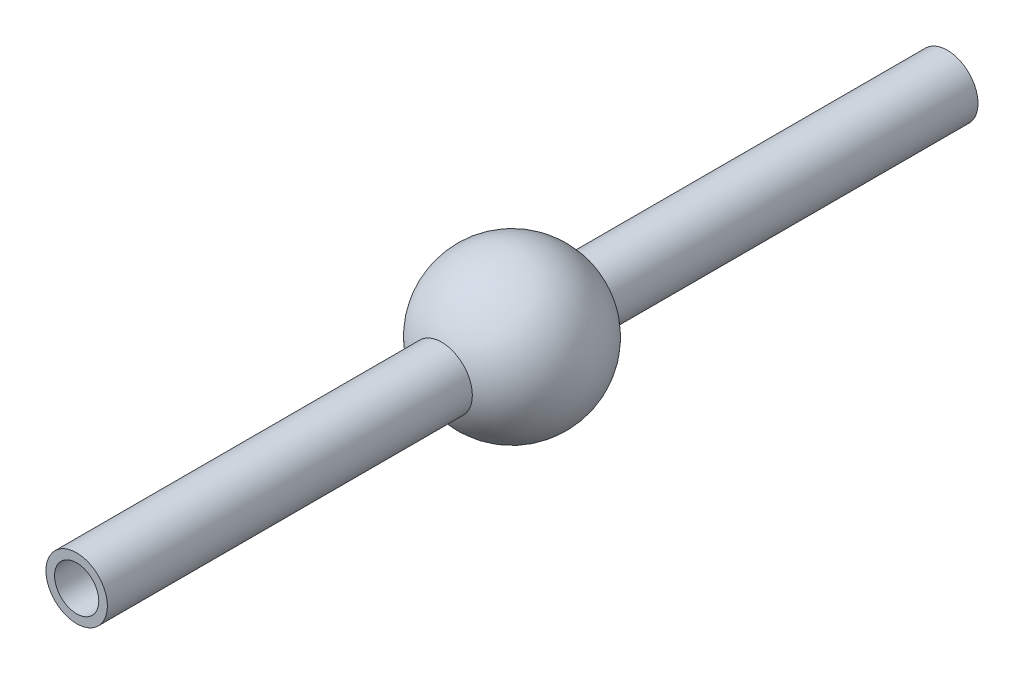
ISO-10303-21;
HEADER;
FILE_DESCRIPTION(('STEP AP214'),'2;1');
FILE_NAME('part.step','',(''),(''),'','','');
FILE_SCHEMA(('AUTOMOTIVE_DESIGN { 1 0 10303 214 1 1 1 1 }'));
ENDSEC;
DATA;
#1=APPLICATION_CONTEXT('core data for automotive mechanical design processes');
#2=APPLICATION_PROTOCOL_DEFINITION('international standard','automotive_design',2000,#1);
#3=PRODUCT_CONTEXT('',#1,'mechanical');
#4=PRODUCT('Part','Part','',(#3));
#5=PRODUCT_RELATED_PRODUCT_CATEGORY('part','',(#4));
#6=PRODUCT_DEFINITION_FORMATION('','',#4);
#7=PRODUCT_DEFINITION_CONTEXT('part definition',#1,'design');
#8=PRODUCT_DEFINITION('design','',#6,#7);
#9=PRODUCT_DEFINITION_SHAPE('','',#8);
#10=(LENGTH_UNIT() NAMED_UNIT(*) SI_UNIT(.MILLI.,.METRE.));
#11=(NAMED_UNIT(*) PLANE_ANGLE_UNIT() SI_UNIT($,.RADIAN.));
#12=(NAMED_UNIT(*) SI_UNIT($,.STERADIAN.) SOLID_ANGLE_UNIT());
#13=UNCERTAINTY_MEASURE_WITH_UNIT(LENGTH_MEASURE(1.E-05),#10,'distance_accuracy_value','');
#14=(GEOMETRIC_REPRESENTATION_CONTEXT(3) GLOBAL_UNCERTAINTY_ASSIGNED_CONTEXT((#13)) GLOBAL_UNIT_ASSIGNED_CONTEXT((#10,
#11,#12)) REPRESENTATION_CONTEXT('',''));
#15=CARTESIAN_POINT('',(0.,0.,0.));
#16=DIRECTION('',(0.,0.,1.));
#17=DIRECTION('',(1.,0.,0.));
#18=AXIS2_PLACEMENT_3D('',#15,#16,#17);
#19=CARTESIAN_POINT('',(0.,0.,0.));
#20=DIRECTION('',(0.,0.,-1.));
#21=DIRECTION('',(1.,0.,0.));
#22=AXIS2_PLACEMENT_3D('',#19,#20,#21);
#23=SPHERICAL_SURFACE('',#22,7.935);
#24=CARTESIAN_POINT('',(0.,0.,7.27211111026227));
#25=DIRECTION('',(0.,0.,-1.));
#26=DIRECTION('',(-1.,0.,0.));
#27=AXIS2_PLACEMENT_3D('',#24,#25,#26);
#28=CIRCLE('',#27,3.175);
#29=CARTESIAN_POINT('',(3.175,0.,7.27211111026227));
#30=VERTEX_POINT('',#29);
#31=EDGE_CURVE('E10',#30,#30,#28,.F.);
#32=CARTESIAN_POINT('',(0.,0.,-7.27211111026227));
#33=DIRECTION('',(0.,0.,1.));
#34=DIRECTION('',(1.,0.,0.));
#35=AXIS2_PLACEMENT_3D('',#32,#33,#34);
#36=CIRCLE('',#35,3.175);
#37=CARTESIAN_POINT('',(3.175,0.,-7.27211111026227));
#38=VERTEX_POINT('',#37);
#39=EDGE_CURVE('E36',#38,#38,#36,.F.);
#40=CARTESIAN_POINT('',(3.175,0.,7.27211111026227));
#41=CARTESIAN_POINT('',(3.35061875408829,0.,7.19545028966584));
#42=CARTESIAN_POINT('',(3.5234484279392,0.,7.1124053788516));
#43=CARTESIAN_POINT('',(3.86264964001572,0.,6.93403386141682));
#44=CARTESIAN_POINT('',(4.02902117824133,0.,6.83870725479628));
#45=CARTESIAN_POINT('',(4.3544261439167,0.,6.63625883037816));
#46=CARTESIAN_POINT('',(4.51345957136648,0.,6.52913701258059));
#47=CARTESIAN_POINT('',(4.82335591567042,0.,6.30366379476571));
#48=CARTESIAN_POINT('',(4.97421883252459,0.,6.18531239474841));
#49=CARTESIAN_POINT('',(5.26698218728778,0.,5.93799992787177));
#50=CARTESIAN_POINT('',(5.40888262519679,0.,5.80903886101244));
#51=CARTESIAN_POINT('',(5.68297672430487,0.,5.54118387560699));
#52=CARTESIAN_POINT('',(5.81517038550393,0.,5.40228995706086));
#53=CARTESIAN_POINT('',(6.06915738229662,0.,5.11529786085084));
#54=CARTESIAN_POINT('',(6.19095071789024,0.,4.96719968318695));
#55=CARTESIAN_POINT('',(6.42349812337258,0.,4.66257603752238));
#56=CARTESIAN_POINT('',(6.5342521932613,0.,4.5060505695217));
#57=CARTESIAN_POINT('',(6.74414002869088,0.,4.18539349921624));
#58=CARTESIAN_POINT('',(6.84327379423173,0.,4.02126189691145));
#59=CARTESIAN_POINT('',(7.02940094791241,0.,3.68625362358385));
#60=CARTESIAN_POINT('',(7.11639433605223,0.,3.51537695256104));
#61=CARTESIAN_POINT('',(7.27778435160519,0.,3.16777499152858));
#62=CARTESIAN_POINT('',(7.35218097901833,0.,2.99104970151894));
#63=CARTESIAN_POINT('',(7.48798717493119,0.,2.63267763562167));
#64=CARTESIAN_POINT('',(7.54939674343092,0.,2.45103085973403));
#65=CARTESIAN_POINT('',(7.65890665573858,0.,2.08376877407665));
#66=CARTESIAN_POINT('',(7.70700699954652,0.,1.8981534643069));
#67=CARTESIAN_POINT('',(7.78964611932278,0.,1.52392808256459));
#68=CARTESIAN_POINT('',(7.82418489529111,0.,1.33531801059203));
#69=CARTESIAN_POINT('',(7.87951968268698,0.,0.956092587181757));
#70=CARTESIAN_POINT('',(7.90031569411452,0.,0.76547723574404));
#71=CARTESIAN_POINT('',(7.92805585277103,0.,0.383241256204216));
#72=CARTESIAN_POINT('',(7.935,0.,0.191620628102108));
#73=CARTESIAN_POINT('',(7.935,0.,-0.191620628102107));
#74=CARTESIAN_POINT('',(7.92805585277103,0.,-0.383241256204214));
#75=CARTESIAN_POINT('',(7.90031569411452,0.,-0.765477235744038));
#76=CARTESIAN_POINT('',(7.87951968268698,0.,-0.956092587181756));
#77=CARTESIAN_POINT('',(7.82418489529111,0.,-1.33531801059203));
#78=CARTESIAN_POINT('',(7.78964611932278,0.,-1.52392808256459));
#79=CARTESIAN_POINT('',(7.70700699954652,0.,-1.8981534643069));
#80=CARTESIAN_POINT('',(7.65890665573858,0.,-2.08376877407665));
#81=CARTESIAN_POINT('',(7.54939674343092,0.,-2.45103085973403));
#82=CARTESIAN_POINT('',(7.48798717493119,0.,-2.63267763562167));
#83=CARTESIAN_POINT('',(7.35218097901833,0.,-2.99104970151894));
#84=CARTESIAN_POINT('',(7.27778435160519,0.,-3.16777499152858));
#85=CARTESIAN_POINT('',(7.11639433605223,0.,-3.51537695256104));
#86=CARTESIAN_POINT('',(7.02940094791241,0.,-3.68625362358385));
#87=CARTESIAN_POINT('',(6.84327379423173,0.,-4.02126189691145));
#88=CARTESIAN_POINT('',(6.74414002869088,0.,-4.18539349921624));
#89=CARTESIAN_POINT('',(6.5342521932613,0.,-4.5060505695217));
#90=CARTESIAN_POINT('',(6.42349812337258,0.,-4.66257603752238));
#91=CARTESIAN_POINT('',(6.19095071789024,0.,-4.96719968318695));
#92=CARTESIAN_POINT('',(6.06915738229662,0.,-5.11529786085084));
#93=CARTESIAN_POINT('',(5.81517038550393,0.,-5.40228995706086));
#94=CARTESIAN_POINT('',(5.68297672430487,0.,-5.54118387560699));
#95=CARTESIAN_POINT('',(5.40888262519679,0.,-5.80903886101244));
#96=CARTESIAN_POINT('',(5.26698218728778,0.,-5.93799992787177));
#97=CARTESIAN_POINT('',(4.97421883252459,0.,-6.1853123947484));
#98=CARTESIAN_POINT('',(4.82335591567042,0.,-6.30366379476571));
#99=CARTESIAN_POINT('',(4.51345957136648,0.,-6.52913701258059));
#100=CARTESIAN_POINT('',(4.35442614391671,0.,-6.63625883037816));
#101=CARTESIAN_POINT('',(4.02902117824133,0.,-6.83870725479628));
#102=CARTESIAN_POINT('',(3.86264964001572,0.,-6.93403386141682));
#103=CARTESIAN_POINT('',(3.5234484279392,0.,-7.1124053788516));
#104=CARTESIAN_POINT('',(3.3506187540883,0.,-7.19545028966584));
#105=CARTESIAN_POINT('',(3.175,0.,-7.27211111026227));
#106=B_SPLINE_CURVE_WITH_KNOTS('',3,(#40,#41,#42,#43,#44,#45,#46,#47,#48,#49,#50,#51,#52,#53,
#54,#55,#56,#57,#58,#59,#60,#61,#62,#63,#64,#65,#66,#67,#68,#69,#70,#71,#72,#73,#74,#75,#76,#77,
#78,#79,#80,#81,#82,#83,#84,#85,#86,#87,#88,#89,#90,#91,#92,#93,#94,#95,#96,#97,#98,#99,#100,
#101,#102,#103,#104,#105),.UNSPECIFIED.,.F.,.F.,(4,2,2,2,2,2,2,2,2,2,2,2,2,2,2,2,2,2,2,2,2,2,2,
2,2,2,2,2,2,2,2,2,4),(0.,0.574736266006542,1.14947253201308,1.72420879801963,2.29894506402617,
2.87368133003271,3.44841759603925,4.0231538620458,4.59789012805234,5.17262639405888,
5.74736266006542,6.32209892607196,6.89683519207851,7.47157145808505,8.04630772409159,
8.62104399009813,9.19578025610467,9.77051652211122,10.3452527881178,10.9199890541243,
11.4947253201308,12.0694615861374,12.6441978521439,13.2189341181505,13.793670384157,
14.3684066501636,14.9431429161701,15.5178791821766,16.0926154481832,16.6673517141897,
17.2420879801963,17.8168242462028,18.3915605122093),.UNSPECIFIED.);
#107=EDGE_CURVE('BSEAM30',#30,#38,#106,.T.);
#108=ORIENTED_EDGE('',*,*,#31,.F.);
#109=ORIENTED_EDGE('',*,*,#39,.F.);
#110=ORIENTED_EDGE('',*,*,#107,.T.);
#111=ORIENTED_EDGE('',*,*,#107,.F.);
#112=EDGE_LOOP('',(#108,#110,#109,#111));
#113=FACE_BOUND('',#112,.T.);
#114=ADVANCED_FACE('F30',(#113),#23,.T.);
#115=CARTESIAN_POINT('',(0.,0.,-45.));
#116=DIRECTION('',(0.,0.,1.));
#117=DIRECTION('',(1.,0.,0.));
#118=AXIS2_PLACEMENT_3D('',#115,#116,#117);
#119=CYLINDRICAL_SURFACE('',#118,3.175);
#120=CARTESIAN_POINT('',(0.,0.,45.));
#121=DIRECTION('',(0.,0.,1.));
#122=DIRECTION('',(1.,0.,0.));
#123=AXIS2_PLACEMENT_3D('',#120,#121,#122);
#124=CIRCLE('',#123,3.175);
#125=CARTESIAN_POINT('',(3.175,0.,45.));
#126=VERTEX_POINT('',#125);
#127=EDGE_CURVE('E49',#126,#126,#124,.T.);
#128=CARTESIAN_POINT('',(3.175,0.,7.27211111026228));
#129=CARTESIAN_POINT('',(3.175,0.,7.66510995286371));
#130=CARTESIAN_POINT('',(3.175,0.,8.05810879546515));
#131=CARTESIAN_POINT('',(3.175,0.,8.84410648066801));
#132=CARTESIAN_POINT('',(3.175,0.,9.23710532326945));
#133=CARTESIAN_POINT('',(3.175,0.,10.0231030084723));
#134=CARTESIAN_POINT('',(3.175,0.,10.4161018510738));
#135=CARTESIAN_POINT('',(3.175,0.,11.2020995362766));
#136=CARTESIAN_POINT('',(3.175,0.,11.5950983788781));
#137=CARTESIAN_POINT('',(3.175,0.,12.3810960640809));
#138=CARTESIAN_POINT('',(3.175,0.,12.7740949066824));
#139=CARTESIAN_POINT('',(3.175,0.,13.5600925918852));
#140=CARTESIAN_POINT('',(3.175,0.,13.9530914344867));
#141=CARTESIAN_POINT('',(3.175,0.,14.7390891196895));
#142=CARTESIAN_POINT('',(3.175,0.,15.132087962291));
#143=CARTESIAN_POINT('',(3.175,0.,15.9180856474938));
#144=CARTESIAN_POINT('',(3.175,0.,16.3110844900953));
#145=CARTESIAN_POINT('',(3.175,0.,17.0970821752981));
#146=CARTESIAN_POINT('',(3.175,0.,17.4900810178996));
#147=CARTESIAN_POINT('',(3.175,0.,18.2760787031024));
#148=CARTESIAN_POINT('',(3.175,0.,18.6690775457039));
#149=CARTESIAN_POINT('',(3.175,0.,19.4550752309067));
#150=CARTESIAN_POINT('',(3.175,0.,19.8480740735082));
#151=CARTESIAN_POINT('',(3.175,0.,20.634071758711));
#152=CARTESIAN_POINT('',(3.175,0.,21.0270706013125));
#153=CARTESIAN_POINT('',(3.175,0.,21.8130682865154));
#154=CARTESIAN_POINT('',(3.175,0.,22.2060671291168));
#155=CARTESIAN_POINT('',(3.175,0.,22.9920648143197));
#156=CARTESIAN_POINT('',(3.175,0.,23.3850636569211));
#157=CARTESIAN_POINT('',(3.175,0.,24.171061342124));
#158=CARTESIAN_POINT('',(3.175,0.,24.5640601847254));
#159=CARTESIAN_POINT('',(3.175,0.,25.3500578699283));
#160=CARTESIAN_POINT('',(3.175,0.,25.7430567125297));
#161=CARTESIAN_POINT('',(3.175,0.,26.5290543977326));
#162=CARTESIAN_POINT('',(3.175,0.,26.922053240334));
#163=CARTESIAN_POINT('',(3.175,0.,27.7080509255369));
#164=CARTESIAN_POINT('',(3.175,0.,28.1010497681383));
#165=CARTESIAN_POINT('',(3.175,0.,28.8870474533412));
#166=CARTESIAN_POINT('',(3.175,0.,29.2800462959426));
#167=CARTESIAN_POINT('',(3.175,0.,30.0660439811455));
#168=CARTESIAN_POINT('',(3.175,0.,30.4590428237469));
#169=CARTESIAN_POINT('',(3.175,0.,31.2450405089498));
#170=CARTESIAN_POINT('',(3.175,0.,31.6380393515512));
#171=CARTESIAN_POINT('',(3.175,0.,32.4240370367541));
#172=CARTESIAN_POINT('',(3.175,0.,32.8170358793555));
#173=CARTESIAN_POINT('',(3.175,0.,33.6030335645584));
#174=CARTESIAN_POINT('',(3.175,0.,33.9960324071598));
#175=CARTESIAN_POINT('',(3.175,0.,34.7820300923627));
#176=CARTESIAN_POINT('',(3.175,0.,35.1750289349641));
#177=CARTESIAN_POINT('',(3.175,0.,35.961026620167));
#178=CARTESIAN_POINT('',(3.175,0.,36.3540254627684));
#179=CARTESIAN_POINT('',(3.175,0.,37.1400231479713));
#180=CARTESIAN_POINT('',(3.175,0.,37.5330219905727));
#181=CARTESIAN_POINT('',(3.175,0.,38.3190196757756));
#182=CARTESIAN_POINT('',(3.175,0.,38.712018518377));
#183=CARTESIAN_POINT('',(3.175,0.,39.4980162035799));
#184=CARTESIAN_POINT('',(3.175,0.,39.8910150461813));
#185=CARTESIAN_POINT('',(3.175,0.,40.6770127313842));
#186=CARTESIAN_POINT('',(3.175,0.,41.0700115739856));
#187=CARTESIAN_POINT('',(3.175,0.,41.8560092591885));
#188=CARTESIAN_POINT('',(3.175,0.,42.2490081017899));
#189=CARTESIAN_POINT('',(3.175,0.,43.0350057869928));
#190=CARTESIAN_POINT('',(3.175,0.,43.4280046295942));
#191=CARTESIAN_POINT('',(3.175,0.,44.2140023147971));
#192=CARTESIAN_POINT('',(3.175,0.,44.6070011573985));
#193=CARTESIAN_POINT('',(3.175,0.,45.));
#194=B_SPLINE_CURVE_WITH_KNOTS('',3,(#128,#129,#130,#131,#132,#133,#134,#135,#136,#137,#138,
#139,#140,#141,#142,#143,#144,#145,#146,#147,#148,#149,#150,#151,#152,#153,#154,#155,#156,#157,
#158,#159,#160,#161,#162,#163,#164,#165,#166,#167,#168,#169,#170,#171,#172,#173,#174,#175,#176,
#177,#178,#179,#180,#181,#182,#183,#184,#185,#186,#187,#188,#189,#190,#191,#192,#193),
.UNSPECIFIED.,.F.,.F.,(4,2,2,2,2,2,2,2,2,2,2,2,2,2,2,2,2,2,2,2,2,2,2,2,2,2,2,2,2,2,2,2,4),(0.,
1.1789965278043,2.3579930556086,3.53698958341291,4.71598611121721,5.89498263902152,
7.07397916682582,8.25297569463013,9.43197222243443,10.6109687502387,11.789965278043,
12.9689618058473,14.1479583336516,15.3269548614559,16.5059513892602,17.6849479170645,
18.8639444448688,20.0429409726732,21.2219375004775,22.4009340282818,23.5799305560861,
24.7589270838904,25.9379236116947,27.116920139499,28.2959166673033,29.4749131951076,
30.6539097229119,31.8329062507162,33.0119027785205,34.1908993063248,35.3698958341291,
36.5488923619334,37.7278888897377),.UNSPECIFIED.);
#195=EDGE_CURVE('BSEAM69',#30,#126,#194,.T.);
#196=ORIENTED_EDGE('',*,*,#31,.T.);
#197=ORIENTED_EDGE('',*,*,#127,.F.);
#198=ORIENTED_EDGE('',*,*,#195,.T.);
#199=ORIENTED_EDGE('',*,*,#195,.F.);
#200=EDGE_LOOP('',(#196,#198,#197,#199));
#201=FACE_BOUND('',#200,.T.);
#202=ADVANCED_FACE('F69',(#201),#119,.T.);
#203=CARTESIAN_POINT('',(0.,0.,-45.));
#204=DIRECTION('',(0.,0.,1.));
#205=DIRECTION('',(1.,0.,0.));
#206=AXIS2_PLACEMENT_3D('',#203,#204,#205);
#207=CIRCLE('',#206,3.175);
#208=CARTESIAN_POINT('',(3.175,0.,-45.));
#209=VERTEX_POINT('',#208);
#210=EDGE_CURVE('E40',#209,#209,#207,.T.);
#211=CARTESIAN_POINT('',(3.175,0.,-7.27211111026228));
#212=CARTESIAN_POINT('',(3.175,0.,-7.66510995286371));
#213=CARTESIAN_POINT('',(3.175,0.,-8.05810879546515));
#214=CARTESIAN_POINT('',(3.175,0.,-8.84410648066802));
#215=CARTESIAN_POINT('',(3.175,0.,-9.23710532326945));
#216=CARTESIAN_POINT('',(3.175,0.,-10.0231030084723));
#217=CARTESIAN_POINT('',(3.175,0.,-10.4161018510738));
#218=CARTESIAN_POINT('',(3.175,0.,-11.2020995362766));
#219=CARTESIAN_POINT('',(3.175,0.,-11.5950983788781));
#220=CARTESIAN_POINT('',(3.175,0.,-12.3810960640809));
#221=CARTESIAN_POINT('',(3.175,0.,-12.7740949066824));
#222=CARTESIAN_POINT('',(3.175,0.,-13.5600925918852));
#223=CARTESIAN_POINT('',(3.175,0.,-13.9530914344867));
#224=CARTESIAN_POINT('',(3.175,0.,-14.7390891196895));
#225=CARTESIAN_POINT('',(3.175,0.,-15.132087962291));
#226=CARTESIAN_POINT('',(3.175,0.,-15.9180856474938));
#227=CARTESIAN_POINT('',(3.175,0.,-16.3110844900953));
#228=CARTESIAN_POINT('',(3.175,0.,-17.0970821752981));
#229=CARTESIAN_POINT('',(3.175,0.,-17.4900810178996));
#230=CARTESIAN_POINT('',(3.175,0.,-18.2760787031024));
#231=CARTESIAN_POINT('',(3.175,0.,-18.6690775457039));
#232=CARTESIAN_POINT('',(3.175,0.,-19.4550752309068));
#233=CARTESIAN_POINT('',(3.175,0.,-19.8480740735082));
#234=CARTESIAN_POINT('',(3.175,0.,-20.6340717587111));
#235=CARTESIAN_POINT('',(3.175,0.,-21.0270706013125));
#236=CARTESIAN_POINT('',(3.175,0.,-21.8130682865154));
#237=CARTESIAN_POINT('',(3.175,0.,-22.2060671291168));
#238=CARTESIAN_POINT('',(3.175,0.,-22.9920648143197));
#239=CARTESIAN_POINT('',(3.175,0.,-23.3850636569211));
#240=CARTESIAN_POINT('',(3.175,0.,-24.171061342124));
#241=CARTESIAN_POINT('',(3.175,0.,-24.5640601847254));
#242=CARTESIAN_POINT('',(3.175,0.,-25.3500578699283));
#243=CARTESIAN_POINT('',(3.175,0.,-25.7430567125297));
#244=CARTESIAN_POINT('',(3.175,0.,-26.5290543977326));
#245=CARTESIAN_POINT('',(3.175,0.,-26.922053240334));
#246=CARTESIAN_POINT('',(3.175,0.,-27.7080509255369));
#247=CARTESIAN_POINT('',(3.175,0.,-28.1010497681383));
#248=CARTESIAN_POINT('',(3.175,0.,-28.8870474533412));
#249=CARTESIAN_POINT('',(3.175,0.,-29.2800462959426));
#250=CARTESIAN_POINT('',(3.175,0.,-30.0660439811455));
#251=CARTESIAN_POINT('',(3.175,0.,-30.4590428237469));
#252=CARTESIAN_POINT('',(3.175,0.,-31.2450405089498));
#253=CARTESIAN_POINT('',(3.175,0.,-31.6380393515512));
#254=CARTESIAN_POINT('',(3.175,0.,-32.4240370367541));
#255=CARTESIAN_POINT('',(3.175,0.,-32.8170358793555));
#256=CARTESIAN_POINT('',(3.175,0.,-33.6030335645584));
#257=CARTESIAN_POINT('',(3.175,0.,-33.9960324071598));
#258=CARTESIAN_POINT('',(3.175,0.,-34.7820300923627));
#259=CARTESIAN_POINT('',(3.175,0.,-35.1750289349641));
#260=CARTESIAN_POINT('',(3.175,0.,-35.961026620167));
#261=CARTESIAN_POINT('',(3.175,0.,-36.3540254627684));
#262=CARTESIAN_POINT('',(3.175,0.,-37.1400231479713));
#263=CARTESIAN_POINT('',(3.175,0.,-37.5330219905727));
#264=CARTESIAN_POINT('',(3.175,0.,-38.3190196757756));
#265=CARTESIAN_POINT('',(3.175,0.,-38.7120185183771));
#266=CARTESIAN_POINT('',(3.175,0.,-39.4980162035799));
#267=CARTESIAN_POINT('',(3.175,0.,-39.8910150461814));
#268=CARTESIAN_POINT('',(3.175,0.,-40.6770127313842));
#269=CARTESIAN_POINT('',(3.175,0.,-41.0700115739857));
#270=CARTESIAN_POINT('',(3.175,0.,-41.8560092591885));
#271=CARTESIAN_POINT('',(3.175,0.,-42.24900810179));
#272=CARTESIAN_POINT('',(3.175,0.,-43.0350057869928));
#273=CARTESIAN_POINT('',(3.175,0.,-43.4280046295943));
#274=CARTESIAN_POINT('',(3.175,0.,-44.2140023147971));
#275=CARTESIAN_POINT('',(3.175,0.,-44.6070011573986));
#276=CARTESIAN_POINT('',(3.175,0.,-45.));
#277=B_SPLINE_CURVE_WITH_KNOTS('',3,(#211,#212,#213,#214,#215,#216,#217,#218,#219,#220,#221,
#222,#223,#224,#225,#226,#227,#228,#229,#230,#231,#232,#233,#234,#235,#236,#237,#238,#239,#240,
#241,#242,#243,#244,#245,#246,#247,#248,#249,#250,#251,#252,#253,#254,#255,#256,#257,#258,#259,
#260,#261,#262,#263,#264,#265,#266,#267,#268,#269,#270,#271,#272,#273,#274,#275,#276),
.UNSPECIFIED.,.F.,.F.,(4,2,2,2,2,2,2,2,2,2,2,2,2,2,2,2,2,2,2,2,2,2,2,2,2,2,2,2,2,2,2,2,4),(0.,
1.1789965278043,2.35799305560861,3.53698958341291,4.71598611121721,5.89498263902152,
7.07397916682582,8.25297569463013,9.43197222243443,10.6109687502387,11.789965278043,
12.9689618058473,14.1479583336516,15.326954861456,16.5059513892603,17.6849479170646,
18.8639444448689,20.0429409726732,21.2219375004775,22.4009340282818,23.5799305560861,
24.7589270838904,25.9379236116947,27.116920139499,28.2959166673033,29.4749131951076,
30.6539097229119,31.8329062507162,33.0119027785205,34.1908993063248,35.3698958341291,
36.5488923619334,37.7278888897377),.UNSPECIFIED.);
#278=EDGE_CURVE('BSEAM74',#38,#209,#277,.T.);
#279=ORIENTED_EDGE('',*,*,#39,.T.);
#280=ORIENTED_EDGE('',*,*,#210,.T.);
#281=ORIENTED_EDGE('',*,*,#278,.T.);
#282=ORIENTED_EDGE('',*,*,#278,.F.);
#283=EDGE_LOOP('',(#279,#281,#280,#282));
#284=FACE_BOUND('',#283,.T.);
#285=ADVANCED_FACE('F74',(#284),#119,.T.);
#286=CARTESIAN_POINT('',(0.,0.,-45.));
#287=DIRECTION('',(0.,0.,1.));
#288=DIRECTION('',(1.,0.,0.));
#289=AXIS2_PLACEMENT_3D('',#286,#287,#288);
#290=PLANE('',#289);
#291=CARTESIAN_POINT('',(0.,0.,-45.));
#292=DIRECTION('',(0.,0.,1.));
#293=DIRECTION('',(1.,0.,0.));
#294=AXIS2_PLACEMENT_3D('',#291,#292,#293);
#295=CIRCLE('',#294,2.286);
#296=CARTESIAN_POINT('',(2.286,0.,-45.));
#297=VERTEX_POINT('',#296);
#298=EDGE_CURVE('E44',#297,#297,#295,.T.);
#299=ORIENTED_EDGE('',*,*,#298,.T.);
#300=EDGE_LOOP('',(#299));
#301=FACE_BOUND('',#300,.T.);
#302=ORIENTED_EDGE('',*,*,#210,.F.);
#303=EDGE_LOOP('',(#302));
#304=FACE_BOUND('',#303,.T.);
#305=ADVANCED_FACE('F65',(#301,#304),#290,.F.);
#306=CARTESIAN_POINT('',(0.,0.,-45.));
#307=DIRECTION('',(0.,0.,1.));
#308=DIRECTION('',(1.,0.,0.));
#309=AXIS2_PLACEMENT_3D('',#306,#307,#308);
#310=CYLINDRICAL_SURFACE('',#309,2.286);
#311=CARTESIAN_POINT('',(0.,0.,45.));
#312=DIRECTION('',(0.,0.,1.));
#313=DIRECTION('',(1.,0.,0.));
#314=AXIS2_PLACEMENT_3D('',#311,#312,#313);
#315=CIRCLE('',#314,2.286);
#316=CARTESIAN_POINT('',(2.286,0.,45.));
#317=VERTEX_POINT('',#316);
#318=EDGE_CURVE('E52',#317,#317,#315,.T.);
#319=CARTESIAN_POINT('',(2.286,0.,-45.));
#320=CARTESIAN_POINT('',(2.286,0.,-44.0625));
#321=CARTESIAN_POINT('',(2.286,0.,-43.125));
#322=CARTESIAN_POINT('',(2.286,0.,-41.25));
#323=CARTESIAN_POINT('',(2.286,0.,-40.3125));
#324=CARTESIAN_POINT('',(2.286,0.,-38.4375));
#325=CARTESIAN_POINT('',(2.286,0.,-37.5));
#326=CARTESIAN_POINT('',(2.286,0.,-35.625));
#327=CARTESIAN_POINT('',(2.286,0.,-34.6875));
#328=CARTESIAN_POINT('',(2.286,0.,-32.8125));
#329=CARTESIAN_POINT('',(2.286,0.,-31.875));
#330=CARTESIAN_POINT('',(2.286,0.,-30.));
#331=CARTESIAN_POINT('',(2.286,0.,-29.0625));
#332=CARTESIAN_POINT('',(2.286,0.,-27.1875));
#333=CARTESIAN_POINT('',(2.286,0.,-26.25));
#334=CARTESIAN_POINT('',(2.286,0.,-24.375));
#335=CARTESIAN_POINT('',(2.286,0.,-23.4375));
#336=CARTESIAN_POINT('',(2.286,0.,-21.5625));
#337=CARTESIAN_POINT('',(2.286,0.,-20.625));
#338=CARTESIAN_POINT('',(2.286,0.,-18.75));
#339=CARTESIAN_POINT('',(2.286,0.,-17.8125));
#340=CARTESIAN_POINT('',(2.286,0.,-15.9375));
#341=CARTESIAN_POINT('',(2.286,0.,-15.));
#342=CARTESIAN_POINT('',(2.286,0.,-13.125));
#343=CARTESIAN_POINT('',(2.286,0.,-12.1875));
#344=CARTESIAN_POINT('',(2.286,0.,-10.3125));
#345=CARTESIAN_POINT('',(2.286,0.,-9.37500000000001));
#346=CARTESIAN_POINT('',(2.286,0.,-7.50000000000001));
#347=CARTESIAN_POINT('',(2.286,0.,-6.56250000000001));
#348=CARTESIAN_POINT('',(2.286,0.,-4.68750000000001));
#349=CARTESIAN_POINT('',(2.286,0.,-3.75000000000001));
#350=CARTESIAN_POINT('',(2.286,0.,-1.87500000000001));
#351=CARTESIAN_POINT('',(2.286,0.,-0.937500000000008));
#352=CARTESIAN_POINT('',(2.286,0.,0.937499999999994));
#353=CARTESIAN_POINT('',(2.286,0.,1.87499999999999));
#354=CARTESIAN_POINT('',(2.286,0.,3.74999999999999));
#355=CARTESIAN_POINT('',(2.286,0.,4.68749999999999));
#356=CARTESIAN_POINT('',(2.286,0.,6.56249999999999));
#357=CARTESIAN_POINT('',(2.286,0.,7.49999999999999));
#358=CARTESIAN_POINT('',(2.286,0.,9.37499999999999));
#359=CARTESIAN_POINT('',(2.286,0.,10.3125));
#360=CARTESIAN_POINT('',(2.286,0.,12.1875));
#361=CARTESIAN_POINT('',(2.286,0.,13.125));
#362=CARTESIAN_POINT('',(2.286,0.,15.));
#363=CARTESIAN_POINT('',(2.286,0.,15.9375));
#364=CARTESIAN_POINT('',(2.286,0.,17.8125));
#365=CARTESIAN_POINT('',(2.286,0.,18.75));
#366=CARTESIAN_POINT('',(2.286,0.,20.625));
#367=CARTESIAN_POINT('',(2.286,0.,21.5625));
#368=CARTESIAN_POINT('',(2.286,0.,23.4375));
#369=CARTESIAN_POINT('',(2.286,0.,24.375));
#370=CARTESIAN_POINT('',(2.286,0.,26.25));
#371=CARTESIAN_POINT('',(2.286,0.,27.1875));
#372=CARTESIAN_POINT('',(2.286,0.,29.0625));
#373=CARTESIAN_POINT('',(2.286,0.,30.));
#374=CARTESIAN_POINT('',(2.286,0.,31.875));
#375=CARTESIAN_POINT('',(2.286,0.,32.8125));
#376=CARTESIAN_POINT('',(2.286,0.,34.6875));
#377=CARTESIAN_POINT('',(2.286,0.,35.625));
#378=CARTESIAN_POINT('',(2.286,0.,37.5));
#379=CARTESIAN_POINT('',(2.286,0.,38.4375));
#380=CARTESIAN_POINT('',(2.286,0.,40.3125));
#381=CARTESIAN_POINT('',(2.286,0.,41.25));
#382=CARTESIAN_POINT('',(2.286,0.,43.125));
#383=CARTESIAN_POINT('',(2.286,0.,44.0625));
#384=CARTESIAN_POINT('',(2.286,0.,45.));
#385=B_SPLINE_CURVE_WITH_KNOTS('',3,(#319,#320,#321,#322,#323,#324,#325,#326,#327,#328,#329,
#330,#331,#332,#333,#334,#335,#336,#337,#338,#339,#340,#341,#342,#343,#344,#345,#346,#347,#348,
#349,#350,#351,#352,#353,#354,#355,#356,#357,#358,#359,#360,#361,#362,#363,#364,#365,#366,#367,
#368,#369,#370,#371,#372,#373,#374,#375,#376,#377,#378,#379,#380,#381,#382,#383,#384),
.UNSPECIFIED.,.F.,.F.,(4,2,2,2,2,2,2,2,2,2,2,2,2,2,2,2,2,2,2,2,2,2,2,2,2,2,2,2,2,2,2,2,4),(0.,
2.8125,5.625,8.43749999999999,11.25,14.0625,16.875,19.6875,22.5,25.3125,28.125,30.9375,33.75,
36.5625,39.375,42.1875,45.,47.8125,50.625,53.4375,56.25,59.0625,61.875,64.6875,67.5,70.3125,
73.125,75.9375,78.75,81.5625,84.375,87.1875,90.),.UNSPECIFIED.);
#386=EDGE_CURVE('BSEAM56',#297,#317,#385,.T.);
#387=ORIENTED_EDGE('',*,*,#298,.F.);
#388=ORIENTED_EDGE('',*,*,#318,.T.);
#389=ORIENTED_EDGE('',*,*,#386,.T.);
#390=ORIENTED_EDGE('',*,*,#386,.F.);
#391=EDGE_LOOP('',(#387,#389,#388,#390));
#392=FACE_BOUND('',#391,.T.);
#393=ADVANCED_FACE('F56',(#392),#310,.F.);
#394=CARTESIAN_POINT('',(0.,0.,45.));
#395=DIRECTION('',(0.,0.,1.));
#396=DIRECTION('',(1.,0.,0.));
#397=AXIS2_PLACEMENT_3D('',#394,#395,#396);
#398=PLANE('',#397);
#399=ORIENTED_EDGE('',*,*,#127,.T.);
#400=EDGE_LOOP('',(#399));
#401=FACE_BOUND('',#400,.T.);
#402=ORIENTED_EDGE('',*,*,#318,.F.);
#403=EDGE_LOOP('',(#402));
#404=FACE_BOUND('',#403,.T.);
#405=ADVANCED_FACE('F58',(#401,#404),#398,.T.);
#406=CLOSED_SHELL('',(#114,#202,#285,#305,#393,#405));
#407=MANIFOLD_SOLID_BREP('B2',#406);
#408=ADVANCED_BREP_SHAPE_REPRESENTATION('',(#18,#407),#14);
#409=SHAPE_DEFINITION_REPRESENTATION(#9,#408);
ENDSEC;
END-ISO-10303-21;
